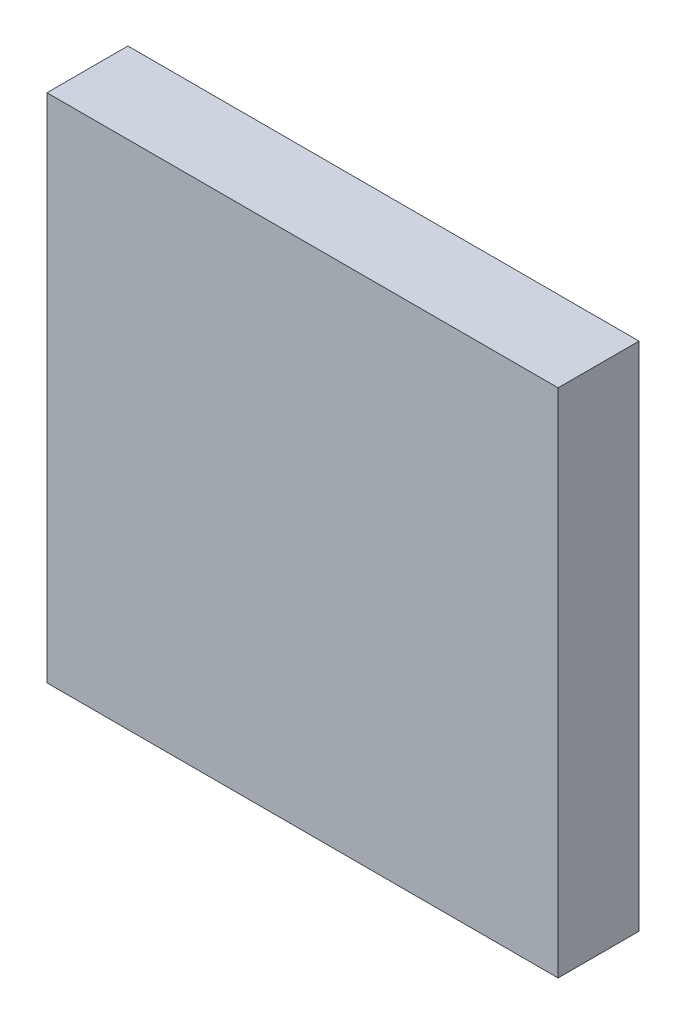
ISO-10303-21;
HEADER;
FILE_DESCRIPTION(('STEP AP214'),'2;1');
FILE_NAME('part.step','',(''),(''),'','','');
FILE_SCHEMA(('AUTOMOTIVE_DESIGN { 1 0 10303 214 1 1 1 1 }'));
ENDSEC;
DATA;
#1=APPLICATION_CONTEXT('core data for automotive mechanical design processes');
#2=APPLICATION_PROTOCOL_DEFINITION('international standard','automotive_design',2000,#1);
#3=PRODUCT_CONTEXT('',#1,'mechanical');
#4=PRODUCT('Part','Part','',(#3));
#5=PRODUCT_RELATED_PRODUCT_CATEGORY('part','',(#4));
#6=PRODUCT_DEFINITION_FORMATION('','',#4);
#7=PRODUCT_DEFINITION_CONTEXT('part definition',#1,'design');
#8=PRODUCT_DEFINITION('design','',#6,#7);
#9=PRODUCT_DEFINITION_SHAPE('','',#8);
#10=(LENGTH_UNIT() NAMED_UNIT(*) SI_UNIT(.MILLI.,.METRE.));
#11=(NAMED_UNIT(*) PLANE_ANGLE_UNIT() SI_UNIT($,.RADIAN.));
#12=(NAMED_UNIT(*) SI_UNIT($,.STERADIAN.) SOLID_ANGLE_UNIT());
#13=UNCERTAINTY_MEASURE_WITH_UNIT(LENGTH_MEASURE(1.E-05),#10,'distance_accuracy_value','');
#14=(GEOMETRIC_REPRESENTATION_CONTEXT(3) GLOBAL_UNCERTAINTY_ASSIGNED_CONTEXT((#13)) GLOBAL_UNIT_ASSIGNED_CONTEXT((#10,
#11,#12)) REPRESENTATION_CONTEXT('',''));
#15=CARTESIAN_POINT('',(0.,0.,0.));
#16=DIRECTION('',(0.,0.,1.));
#17=DIRECTION('',(1.,0.,0.));
#18=AXIS2_PLACEMENT_3D('',#15,#16,#17);
#19=CARTESIAN_POINT('',(-113.012658227848,96.9113924050633,38.));
#20=DIRECTION('',(1.,0.,0.));
#21=DIRECTION('',(0.,1.,0.));
#22=AXIS2_PLACEMENT_3D('',#19,#20,#21);
#23=PLANE('',#22);
#24=DIRECTION('',(0.,-1.,0.));
#25=VECTOR('',#24,1.);
#26=CARTESIAN_POINT('',(-113.012658227848,96.9113924050633,0.));
#27=LINE('',#26,#25);
#28=CARTESIAN_POINT('',(-113.012658227848,96.9113924050633,0.));
#29=VERTEX_POINT('',#28);
#30=CARTESIAN_POINT('',(-113.012658227848,-143.088607594937,0.));
#31=VERTEX_POINT('',#30);
#32=EDGE_CURVE('E96',#29,#31,#27,.T.);
#33=ORIENTED_EDGE('',*,*,#32,.T.);
#34=DIRECTION('',(0.,0.,-1.));
#35=VECTOR('',#34,1.);
#36=CARTESIAN_POINT('',(-113.012658227848,-143.088607594937,38.));
#37=LINE('',#36,#35);
#38=CARTESIAN_POINT('',(-113.012658227848,-143.088607594937,38.));
#39=VERTEX_POINT('',#38);
#40=EDGE_CURVE('E11',#39,#31,#37,.T.);
#41=ORIENTED_EDGE('',*,*,#40,.F.);
#42=DIRECTION('',(0.,-1.,0.));
#43=VECTOR('',#42,1.);
#44=CARTESIAN_POINT('',(-113.012658227848,96.9113924050633,38.));
#45=LINE('',#44,#43);
#46=CARTESIAN_POINT('',(-113.012658227848,96.9113924050633,38.));
#47=VERTEX_POINT('',#46);
#48=EDGE_CURVE('E84',#47,#39,#45,.T.);
#49=ORIENTED_EDGE('',*,*,#48,.F.);
#50=DIRECTION('',(0.,0.,-1.));
#51=VECTOR('',#50,1.);
#52=CARTESIAN_POINT('',(-113.012658227848,96.9113924050633,38.));
#53=LINE('',#52,#51);
#54=EDGE_CURVE('E92',#47,#29,#53,.T.);
#55=ORIENTED_EDGE('',*,*,#54,.T.);
#56=EDGE_LOOP('',(#33,#41,#49,#55));
#57=FACE_BOUND('',#56,.T.);
#58=ADVANCED_FACE('F33',(#57),#23,.F.);
#59=CARTESIAN_POINT('',(-113.012658227848,-143.088607594937,38.));
#60=DIRECTION('',(0.,1.,0.));
#61=DIRECTION('',(0.,0.,1.));
#62=AXIS2_PLACEMENT_3D('',#59,#60,#61);
#63=PLANE('',#62);
#64=DIRECTION('',(1.,0.,0.));
#65=VECTOR('',#64,1.);
#66=CARTESIAN_POINT('',(-113.012658227848,-143.088607594937,0.));
#67=LINE('',#66,#65);
#68=CARTESIAN_POINT('',(126.987341772152,-143.088607594937,0.));
#69=VERTEX_POINT('',#68);
#70=EDGE_CURVE('E88',#31,#69,#67,.T.);
#71=ORIENTED_EDGE('',*,*,#70,.T.);
#72=DIRECTION('',(0.,0.,-1.));
#73=VECTOR('',#72,1.);
#74=CARTESIAN_POINT('',(126.987341772152,-143.088607594937,38.));
#75=LINE('',#74,#73);
#76=CARTESIAN_POINT('',(126.987341772152,-143.088607594937,38.));
#77=VERTEX_POINT('',#76);
#78=EDGE_CURVE('E41',#77,#69,#75,.T.);
#79=ORIENTED_EDGE('',*,*,#78,.F.);
#80=DIRECTION('',(1.,0.,0.));
#81=VECTOR('',#80,1.);
#82=CARTESIAN_POINT('',(-113.012658227848,-143.088607594937,38.));
#83=LINE('',#82,#81);
#84=EDGE_CURVE('E79',#39,#77,#83,.T.);
#85=ORIENTED_EDGE('',*,*,#84,.F.);
#86=ORIENTED_EDGE('',*,*,#40,.T.);
#87=EDGE_LOOP('',(#71,#79,#85,#86));
#88=FACE_BOUND('',#87,.T.);
#89=ADVANCED_FACE('F87',(#88),#63,.F.);
#90=CARTESIAN_POINT('',(126.987341772152,96.9113924050633,38.));
#91=DIRECTION('',(-1.,0.,0.));
#92=DIRECTION('',(0.,-1.,0.));
#93=AXIS2_PLACEMENT_3D('',#90,#91,#92);
#94=PLANE('',#93);
#95=DIRECTION('',(0.,1.,0.));
#96=VECTOR('',#95,1.);
#97=CARTESIAN_POINT('',(126.987341772152,96.9113924050633,0.));
#98=LINE('',#97,#96);
#99=CARTESIAN_POINT('',(126.987341772152,96.9113924050633,0.));
#100=VERTEX_POINT('',#99);
#101=EDGE_CURVE('E66',#69,#100,#98,.T.);
#102=ORIENTED_EDGE('',*,*,#101,.T.);
#103=DIRECTION('',(0.,0.,-1.));
#104=VECTOR('',#103,1.);
#105=CARTESIAN_POINT('',(126.987341772152,96.9113924050633,38.));
#106=LINE('',#105,#104);
#107=CARTESIAN_POINT('',(126.987341772152,96.9113924050633,38.));
#108=VERTEX_POINT('',#107);
#109=EDGE_CURVE('E89',#108,#100,#106,.T.);
#110=ORIENTED_EDGE('',*,*,#109,.F.);
#111=DIRECTION('',(0.,1.,0.));
#112=VECTOR('',#111,1.);
#113=CARTESIAN_POINT('',(126.987341772152,96.9113924050633,38.));
#114=LINE('',#113,#112);
#115=EDGE_CURVE('E82',#77,#108,#114,.T.);
#116=ORIENTED_EDGE('',*,*,#115,.F.);
#117=ORIENTED_EDGE('',*,*,#78,.T.);
#118=EDGE_LOOP('',(#102,#110,#116,#117));
#119=FACE_BOUND('',#118,.T.);
#120=ADVANCED_FACE('F90',(#119),#94,.F.);
#121=CARTESIAN_POINT('',(-113.012658227848,96.9113924050633,38.));
#122=DIRECTION('',(0.,-1.,0.));
#123=DIRECTION('',(0.,0.,-1.));
#124=AXIS2_PLACEMENT_3D('',#121,#122,#123);
#125=PLANE('',#124);
#126=DIRECTION('',(-1.,0.,0.));
#127=VECTOR('',#126,1.);
#128=CARTESIAN_POINT('',(-113.012658227848,96.9113924050633,0.));
#129=LINE('',#128,#127);
#130=EDGE_CURVE('E72',#100,#29,#129,.T.);
#131=ORIENTED_EDGE('',*,*,#130,.T.);
#132=ORIENTED_EDGE('',*,*,#54,.F.);
#133=DIRECTION('',(-1.,0.,0.));
#134=VECTOR('',#133,1.);
#135=CARTESIAN_POINT('',(-113.012658227848,96.9113924050633,38.));
#136=LINE('',#135,#134);
#137=EDGE_CURVE('E49',#108,#47,#136,.T.);
#138=ORIENTED_EDGE('',*,*,#137,.F.);
#139=ORIENTED_EDGE('',*,*,#109,.T.);
#140=EDGE_LOOP('',(#131,#132,#138,#139));
#141=FACE_BOUND('',#140,.T.);
#142=ADVANCED_FACE('F103',(#141),#125,.F.);
#143=CARTESIAN_POINT('',(0.,0.,38.));
#144=DIRECTION('',(0.,0.,1.));
#145=DIRECTION('',(1.,0.,0.));
#146=AXIS2_PLACEMENT_3D('',#143,#144,#145);
#147=PLANE('',#146);
#148=ORIENTED_EDGE('',*,*,#48,.T.);
#149=ORIENTED_EDGE('',*,*,#84,.T.);
#150=ORIENTED_EDGE('',*,*,#115,.T.);
#151=ORIENTED_EDGE('',*,*,#137,.T.);
#152=EDGE_LOOP('',(#148,#149,#150,#151));
#153=FACE_BOUND('',#152,.T.);
#154=ADVANCED_FACE('F80',(#153),#147,.T.);
#155=CARTESIAN_POINT('',(0.,0.,0.));
#156=DIRECTION('',(0.,0.,1.));
#157=DIRECTION('',(1.,0.,0.));
#158=AXIS2_PLACEMENT_3D('',#155,#156,#157);
#159=PLANE('',#158);
#160=ORIENTED_EDGE('',*,*,#32,.F.);
#161=ORIENTED_EDGE('',*,*,#130,.F.);
#162=ORIENTED_EDGE('',*,*,#101,.F.);
#163=ORIENTED_EDGE('',*,*,#70,.F.);
#164=EDGE_LOOP('',(#160,#161,#162,#163));
#165=FACE_BOUND('',#164,.T.);
#166=ADVANCED_FACE('F106',(#165),#159,.F.);
#167=CLOSED_SHELL('',(#58,#89,#120,#142,#154,#166));
#168=MANIFOLD_SOLID_BREP('B2',#167);
#169=ADVANCED_BREP_SHAPE_REPRESENTATION('',(#18,#168),#14);
#170=SHAPE_DEFINITION_REPRESENTATION(#9,#169);
ENDSEC;
END-ISO-10303-21;
